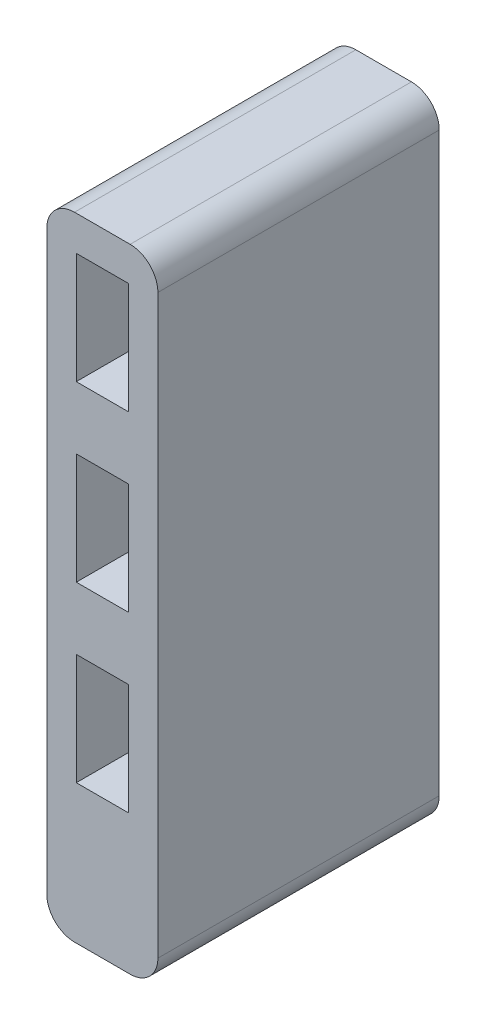
ISO-10303-21;
HEADER;
FILE_DESCRIPTION(('STEP AP214'),'2;1');
FILE_NAME('part.step','',(''),(''),'','','');
FILE_SCHEMA(('AUTOMOTIVE_DESIGN { 1 0 10303 214 1 1 1 1 }'));
ENDSEC;
DATA;
#1=APPLICATION_CONTEXT('core data for automotive mechanical design processes');
#2=APPLICATION_PROTOCOL_DEFINITION('international standard','automotive_design',2000,#1);
#3=PRODUCT_CONTEXT('',#1,'mechanical');
#4=PRODUCT('Part','Part','',(#3));
#5=PRODUCT_RELATED_PRODUCT_CATEGORY('part','',(#4));
#6=PRODUCT_DEFINITION_FORMATION('','',#4);
#7=PRODUCT_DEFINITION_CONTEXT('part definition',#1,'design');
#8=PRODUCT_DEFINITION('design','',#6,#7);
#9=PRODUCT_DEFINITION_SHAPE('','',#8);
#10=(LENGTH_UNIT() NAMED_UNIT(*) SI_UNIT(.MILLI.,.METRE.));
#11=(NAMED_UNIT(*) PLANE_ANGLE_UNIT() SI_UNIT($,.RADIAN.));
#12=(NAMED_UNIT(*) SI_UNIT($,.STERADIAN.) SOLID_ANGLE_UNIT());
#13=UNCERTAINTY_MEASURE_WITH_UNIT(LENGTH_MEASURE(1.E-05),#10,'distance_accuracy_value','');
#14=(GEOMETRIC_REPRESENTATION_CONTEXT(3) GLOBAL_UNCERTAINTY_ASSIGNED_CONTEXT((#13)) GLOBAL_UNIT_ASSIGNED_CONTEXT((#10,
#11,#12)) REPRESENTATION_CONTEXT('',''));
#15=CARTESIAN_POINT('',(0.,0.,0.));
#16=DIRECTION('',(0.,0.,1.));
#17=DIRECTION('',(1.,0.,0.));
#18=AXIS2_PLACEMENT_3D('',#15,#16,#17);
#19=CARTESIAN_POINT('',(-4.,-41.5,40.5));
#20=DIRECTION('',(0.,0.,-1.));
#21=DIRECTION('',(-1.,0.,0.));
#22=AXIS2_PLACEMENT_3D('',#19,#20,#21);
#23=CYLINDRICAL_SURFACE('',#22,4.);
#24=CARTESIAN_POINT('',(-4.,-41.5,0.));
#25=DIRECTION('',(0.,0.,1.));
#26=DIRECTION('',(-1.,0.,0.));
#27=AXIS2_PLACEMENT_3D('',#24,#25,#26);
#28=CIRCLE('',#27,4.);
#29=CARTESIAN_POINT('',(-8.,-41.5,0.));
#30=VERTEX_POINT('',#29);
#31=CARTESIAN_POINT('',(-3.99999999999997,-45.5,0.));
#32=VERTEX_POINT('',#31);
#33=EDGE_CURVE('E263',#30,#32,#28,.T.);
#34=ORIENTED_EDGE('',*,*,#33,.T.);
#35=DIRECTION('',(0.,0.,-1.));
#36=VECTOR('',#35,1.);
#37=CARTESIAN_POINT('',(-3.99999999999997,-45.5,40.5));
#38=LINE('',#37,#36);
#39=CARTESIAN_POINT('',(-3.99999999999997,-45.5,40.5));
#40=VERTEX_POINT('',#39);
#41=EDGE_CURVE('E11',#40,#32,#38,.T.);
#42=ORIENTED_EDGE('',*,*,#41,.F.);
#43=CARTESIAN_POINT('',(-4.,-41.5,40.5));
#44=DIRECTION('',(0.,0.,1.));
#45=DIRECTION('',(-1.,0.,0.));
#46=AXIS2_PLACEMENT_3D('',#43,#44,#45);
#47=CIRCLE('',#46,4.);
#48=CARTESIAN_POINT('',(-8.,-41.5,40.5));
#49=VERTEX_POINT('',#48);
#50=EDGE_CURVE('E270',#49,#40,#47,.T.);
#51=ORIENTED_EDGE('',*,*,#50,.F.);
#52=DIRECTION('',(0.,0.,-1.));
#53=VECTOR('',#52,1.);
#54=CARTESIAN_POINT('',(-8.,-41.5,40.5));
#55=LINE('',#54,#53);
#56=EDGE_CURVE('E288',#49,#30,#55,.T.);
#57=ORIENTED_EDGE('',*,*,#56,.T.);
#58=EDGE_LOOP('',(#34,#42,#51,#57));
#59=FACE_BOUND('',#58,.T.);
#60=ADVANCED_FACE('F33',(#59),#23,.T.);
#61=CARTESIAN_POINT('',(-3.99999999999997,-45.5,40.5));
#62=DIRECTION('',(0.,1.,0.));
#63=DIRECTION('',(0.,0.,1.));
#64=AXIS2_PLACEMENT_3D('',#61,#62,#63);
#65=PLANE('',#64);
#66=DIRECTION('',(1.,0.,0.));
#67=VECTOR('',#66,1.);
#68=CARTESIAN_POINT('',(-3.99999999999997,-45.5,0.));
#69=LINE('',#68,#67);
#70=CARTESIAN_POINT('',(3.99999999999997,-45.5,0.));
#71=VERTEX_POINT('',#70);
#72=EDGE_CURVE('E291',#32,#71,#69,.T.);
#73=ORIENTED_EDGE('',*,*,#72,.T.);
#74=DIRECTION('',(0.,0.,-1.));
#75=VECTOR('',#74,1.);
#76=CARTESIAN_POINT('',(3.99999999999997,-45.5,40.5));
#77=LINE('',#76,#75);
#78=CARTESIAN_POINT('',(3.99999999999997,-45.5,40.5));
#79=VERTEX_POINT('',#78);
#80=EDGE_CURVE('E40',#79,#71,#77,.T.);
#81=ORIENTED_EDGE('',*,*,#80,.F.);
#82=DIRECTION('',(1.,0.,0.));
#83=VECTOR('',#82,1.);
#84=CARTESIAN_POINT('',(-3.99999999999997,-45.5,40.5));
#85=LINE('',#84,#83);
#86=EDGE_CURVE('E273',#40,#79,#85,.T.);
#87=ORIENTED_EDGE('',*,*,#86,.F.);
#88=ORIENTED_EDGE('',*,*,#41,.T.);
#89=EDGE_LOOP('',(#73,#81,#87,#88));
#90=FACE_BOUND('',#89,.T.);
#91=ADVANCED_FACE('F348',(#90),#65,.F.);
#92=CARTESIAN_POINT('',(4.,-41.5,40.5));
#93=DIRECTION('',(0.,0.,-1.));
#94=DIRECTION('',(-1.,0.,0.));
#95=AXIS2_PLACEMENT_3D('',#92,#93,#94);
#96=CYLINDRICAL_SURFACE('',#95,4.);
#97=CARTESIAN_POINT('',(4.,-41.5,0.));
#98=DIRECTION('',(0.,0.,1.));
#99=DIRECTION('',(1.,0.,0.));
#100=AXIS2_PLACEMENT_3D('',#97,#98,#99);
#101=CIRCLE('',#100,4.);
#102=CARTESIAN_POINT('',(8.,-41.5,0.));
#103=VERTEX_POINT('',#102);
#104=EDGE_CURVE('E293',#71,#103,#101,.T.);
#105=ORIENTED_EDGE('',*,*,#104,.T.);
#106=DIRECTION('',(0.,0.,-1.));
#107=VECTOR('',#106,1.);
#108=CARTESIAN_POINT('',(8.,-41.5,40.5));
#109=LINE('',#108,#107);
#110=CARTESIAN_POINT('',(8.,-41.5,40.5));
#111=VERTEX_POINT('',#110);
#112=EDGE_CURVE('E318',#111,#103,#109,.T.);
#113=ORIENTED_EDGE('',*,*,#112,.F.);
#114=CARTESIAN_POINT('',(4.,-41.5,40.5));
#115=DIRECTION('',(0.,0.,1.));
#116=DIRECTION('',(1.,0.,0.));
#117=AXIS2_PLACEMENT_3D('',#114,#115,#116);
#118=CIRCLE('',#117,4.);
#119=EDGE_CURVE('E276',#79,#111,#118,.T.);
#120=ORIENTED_EDGE('',*,*,#119,.F.);
#121=ORIENTED_EDGE('',*,*,#80,.T.);
#122=EDGE_LOOP('',(#105,#113,#120,#121));
#123=FACE_BOUND('',#122,.T.);
#124=ADVANCED_FACE('F325',(#123),#96,.T.);
#125=CARTESIAN_POINT('',(8.,-41.5,40.5));
#126=DIRECTION('',(-1.,0.,0.));
#127=DIRECTION('',(0.,0.,1.));
#128=AXIS2_PLACEMENT_3D('',#125,#126,#127);
#129=PLANE('',#128);
#130=DIRECTION('',(0.,1.,0.));
#131=VECTOR('',#130,1.);
#132=CARTESIAN_POINT('',(8.,-41.5,0.));
#133=LINE('',#132,#131);
#134=CARTESIAN_POINT('',(8.,41.5,0.));
#135=VERTEX_POINT('',#134);
#136=EDGE_CURVE('E295',#103,#135,#133,.T.);
#137=ORIENTED_EDGE('',*,*,#136,.T.);
#138=DIRECTION('',(0.,0.,-1.));
#139=VECTOR('',#138,1.);
#140=CARTESIAN_POINT('',(8.,41.5,40.5));
#141=LINE('',#140,#139);
#142=CARTESIAN_POINT('',(8.,41.5,40.5));
#143=VERTEX_POINT('',#142);
#144=EDGE_CURVE('E315',#143,#135,#141,.T.);
#145=ORIENTED_EDGE('',*,*,#144,.F.);
#146=DIRECTION('',(0.,1.,0.));
#147=VECTOR('',#146,1.);
#148=CARTESIAN_POINT('',(8.,-41.5,40.5));
#149=LINE('',#148,#147);
#150=EDGE_CURVE('E278',#111,#143,#149,.T.);
#151=ORIENTED_EDGE('',*,*,#150,.F.);
#152=ORIENTED_EDGE('',*,*,#112,.T.);
#153=EDGE_LOOP('',(#137,#145,#151,#152));
#154=FACE_BOUND('',#153,.T.);
#155=ADVANCED_FACE('F336',(#154),#129,.F.);
#156=CARTESIAN_POINT('',(4.,41.5,40.5));
#157=DIRECTION('',(0.,0.,-1.));
#158=DIRECTION('',(-1.,0.,0.));
#159=AXIS2_PLACEMENT_3D('',#156,#157,#158);
#160=CYLINDRICAL_SURFACE('',#159,4.);
#161=CARTESIAN_POINT('',(4.,41.5,0.));
#162=DIRECTION('',(0.,0.,1.));
#163=DIRECTION('',(1.,0.,0.));
#164=AXIS2_PLACEMENT_3D('',#161,#162,#163);
#165=CIRCLE('',#164,4.);
#166=CARTESIAN_POINT('',(3.99999999999997,45.5,0.));
#167=VERTEX_POINT('',#166);
#168=EDGE_CURVE('E297',#135,#167,#165,.T.);
#169=ORIENTED_EDGE('',*,*,#168,.T.);
#170=DIRECTION('',(0.,0.,-1.));
#171=VECTOR('',#170,1.);
#172=CARTESIAN_POINT('',(3.99999999999997,45.5,40.5));
#173=LINE('',#172,#171);
#174=CARTESIAN_POINT('',(3.99999999999997,45.5,40.5));
#175=VERTEX_POINT('',#174);
#176=EDGE_CURVE('E312',#175,#167,#173,.T.);
#177=ORIENTED_EDGE('',*,*,#176,.F.);
#178=CARTESIAN_POINT('',(4.,41.5,40.5));
#179=DIRECTION('',(0.,0.,1.));
#180=DIRECTION('',(1.,0.,0.));
#181=AXIS2_PLACEMENT_3D('',#178,#179,#180);
#182=CIRCLE('',#181,4.);
#183=EDGE_CURVE('E280',#143,#175,#182,.T.);
#184=ORIENTED_EDGE('',*,*,#183,.F.);
#185=ORIENTED_EDGE('',*,*,#144,.T.);
#186=EDGE_LOOP('',(#169,#177,#184,#185));
#187=FACE_BOUND('',#186,.T.);
#188=ADVANCED_FACE('F340',(#187),#160,.T.);
#189=CARTESIAN_POINT('',(-3.99999999999997,45.5,40.5));
#190=DIRECTION('',(0.,-1.,0.));
#191=DIRECTION('',(0.,0.,-1.));
#192=AXIS2_PLACEMENT_3D('',#189,#190,#191);
#193=PLANE('',#192);
#194=DIRECTION('',(-1.,0.,0.));
#195=VECTOR('',#194,1.);
#196=CARTESIAN_POINT('',(-3.99999999999997,45.5,0.));
#197=LINE('',#196,#195);
#198=CARTESIAN_POINT('',(-3.99999999999997,45.5,0.));
#199=VERTEX_POINT('',#198);
#200=EDGE_CURVE('E299',#167,#199,#197,.T.);
#201=ORIENTED_EDGE('',*,*,#200,.T.);
#202=DIRECTION('',(0.,0.,-1.));
#203=VECTOR('',#202,1.);
#204=CARTESIAN_POINT('',(-3.99999999999997,45.5,40.5));
#205=LINE('',#204,#203);
#206=CARTESIAN_POINT('',(-3.99999999999997,45.5,40.5));
#207=VERTEX_POINT('',#206);
#208=EDGE_CURVE('E309',#207,#199,#205,.T.);
#209=ORIENTED_EDGE('',*,*,#208,.F.);
#210=DIRECTION('',(-1.,0.,0.));
#211=VECTOR('',#210,1.);
#212=CARTESIAN_POINT('',(-3.99999999999997,45.5,40.5));
#213=LINE('',#212,#211);
#214=EDGE_CURVE('E282',#175,#207,#213,.T.);
#215=ORIENTED_EDGE('',*,*,#214,.F.);
#216=ORIENTED_EDGE('',*,*,#176,.T.);
#217=EDGE_LOOP('',(#201,#209,#215,#216));
#218=FACE_BOUND('',#217,.T.);
#219=ADVANCED_FACE('F361',(#218),#193,.F.);
#220=CARTESIAN_POINT('',(-4.,41.5,40.5));
#221=DIRECTION('',(0.,0.,-1.));
#222=DIRECTION('',(-1.,0.,0.));
#223=AXIS2_PLACEMENT_3D('',#220,#221,#222);
#224=CYLINDRICAL_SURFACE('',#223,4.);
#225=CARTESIAN_POINT('',(-4.,41.5,0.));
#226=DIRECTION('',(0.,0.,1.));
#227=DIRECTION('',(-1.,0.,0.));
#228=AXIS2_PLACEMENT_3D('',#225,#226,#227);
#229=CIRCLE('',#228,4.);
#230=CARTESIAN_POINT('',(-8.,41.5,0.));
#231=VERTEX_POINT('',#230);
#232=EDGE_CURVE('E301',#199,#231,#229,.T.);
#233=ORIENTED_EDGE('',*,*,#232,.T.);
#234=DIRECTION('',(0.,0.,-1.));
#235=VECTOR('',#234,1.);
#236=CARTESIAN_POINT('',(-8.,41.5,40.5));
#237=LINE('',#236,#235);
#238=CARTESIAN_POINT('',(-8.,41.5,40.5));
#239=VERTEX_POINT('',#238);
#240=EDGE_CURVE('E306',#239,#231,#237,.T.);
#241=ORIENTED_EDGE('',*,*,#240,.F.);
#242=CARTESIAN_POINT('',(-4.,41.5,40.5));
#243=DIRECTION('',(0.,0.,1.));
#244=DIRECTION('',(-1.,0.,0.));
#245=AXIS2_PLACEMENT_3D('',#242,#243,#244);
#246=CIRCLE('',#245,4.);
#247=EDGE_CURVE('E284',#207,#239,#246,.T.);
#248=ORIENTED_EDGE('',*,*,#247,.F.);
#249=ORIENTED_EDGE('',*,*,#208,.T.);
#250=EDGE_LOOP('',(#233,#241,#248,#249));
#251=FACE_BOUND('',#250,.T.);
#252=ADVANCED_FACE('F359',(#251),#224,.T.);
#253=CARTESIAN_POINT('',(-8.,-41.5,40.5));
#254=DIRECTION('',(1.,0.,0.));
#255=DIRECTION('',(0.,0.,-1.));
#256=AXIS2_PLACEMENT_3D('',#253,#254,#255);
#257=PLANE('',#256);
#258=DIRECTION('',(0.,-1.,0.));
#259=VECTOR('',#258,1.);
#260=CARTESIAN_POINT('',(-8.,-41.5,0.));
#261=LINE('',#260,#259);
#262=EDGE_CURVE('E274',#231,#30,#261,.T.);
#263=ORIENTED_EDGE('',*,*,#262,.T.);
#264=ORIENTED_EDGE('',*,*,#56,.F.);
#265=DIRECTION('',(0.,-1.,0.));
#266=VECTOR('',#265,1.);
#267=CARTESIAN_POINT('',(-8.,-41.5,40.5));
#268=LINE('',#267,#266);
#269=EDGE_CURVE('E286',#239,#49,#268,.T.);
#270=ORIENTED_EDGE('',*,*,#269,.F.);
#271=ORIENTED_EDGE('',*,*,#240,.T.);
#272=EDGE_LOOP('',(#263,#264,#270,#271));
#273=FACE_BOUND('',#272,.T.);
#274=ADVANCED_FACE('F354',(#273),#257,.F.);
#275=CARTESIAN_POINT('',(-4.,-41.5,40.5));
#276=DIRECTION('',(0.,0.,-1.));
#277=DIRECTION('',(-1.,0.,0.));
#278=AXIS2_PLACEMENT_3D('',#275,#276,#277);
#279=PLANE('',#278);
#280=DIRECTION('',(-1.,0.,0.));
#281=VECTOR('',#280,1.);
#282=CARTESIAN_POINT('',(-3.74999999999947,-9.5,40.5));
#283=LINE('',#282,#281);
#284=CARTESIAN_POINT('',(3.75000000000053,-9.5,40.5));
#285=VERTEX_POINT('',#284);
#286=CARTESIAN_POINT('',(-3.74999999999947,-9.5,40.5));
#287=VERTEX_POINT('',#286);
#288=EDGE_CURVE('E198',#285,#287,#283,.T.);
#289=ORIENTED_EDGE('',*,*,#288,.F.);
#290=DIRECTION('',(0.,1.,0.));
#291=VECTOR('',#290,1.);
#292=CARTESIAN_POINT('',(3.75000000000053,-9.5,40.5));
#293=LINE('',#292,#291);
#294=CARTESIAN_POINT('',(3.75000000000053,-25.5,40.5));
#295=VERTEX_POINT('',#294);
#296=EDGE_CURVE('E47',#295,#285,#293,.T.);
#297=ORIENTED_EDGE('',*,*,#296,.F.);
#298=DIRECTION('',(1.,0.,0.));
#299=VECTOR('',#298,1.);
#300=CARTESIAN_POINT('',(-3.74999999999947,-25.5,40.5));
#301=LINE('',#300,#299);
#302=CARTESIAN_POINT('',(-3.74999999999947,-25.5,40.5));
#303=VERTEX_POINT('',#302);
#304=EDGE_CURVE('E189',#303,#295,#301,.T.);
#305=ORIENTED_EDGE('',*,*,#304,.F.);
#306=DIRECTION('',(0.,-1.,0.));
#307=VECTOR('',#306,1.);
#308=CARTESIAN_POINT('',(-3.74999999999947,-9.5,40.5));
#309=LINE('',#308,#307);
#310=EDGE_CURVE('E192',#287,#303,#309,.T.);
#311=ORIENTED_EDGE('',*,*,#310,.F.);
#312=EDGE_LOOP('',(#289,#297,#305,#311));
#313=FACE_BOUND('',#312,.T.);
#314=DIRECTION('',(-1.,0.,0.));
#315=VECTOR('',#314,1.);
#316=CARTESIAN_POINT('',(-3.74999999999974,15.5,40.5));
#317=LINE('',#316,#315);
#318=CARTESIAN_POINT('',(3.75000000000027,15.5,40.5));
#319=VERTEX_POINT('',#318);
#320=CARTESIAN_POINT('',(-3.74999999999974,15.5,40.5));
#321=VERTEX_POINT('',#320);
#322=EDGE_CURVE('E222',#319,#321,#317,.T.);
#323=ORIENTED_EDGE('',*,*,#322,.F.);
#324=DIRECTION('',(0.,1.,0.));
#325=VECTOR('',#324,1.);
#326=CARTESIAN_POINT('',(3.75000000000026,15.5,40.5));
#327=LINE('',#326,#325);
#328=CARTESIAN_POINT('',(3.75000000000027,-0.5,40.5));
#329=VERTEX_POINT('',#328);
#330=EDGE_CURVE('E55',#329,#319,#327,.T.);
#331=ORIENTED_EDGE('',*,*,#330,.F.);
#332=DIRECTION('',(1.,0.,0.));
#333=VECTOR('',#332,1.);
#334=CARTESIAN_POINT('',(-3.74999999999973,-0.5,40.5));
#335=LINE('',#334,#333);
#336=CARTESIAN_POINT('',(-3.74999999999973,-0.5,40.5));
#337=VERTEX_POINT('',#336);
#338=EDGE_CURVE('E211',#337,#329,#335,.T.);
#339=ORIENTED_EDGE('',*,*,#338,.F.);
#340=DIRECTION('',(0.,-1.,0.));
#341=VECTOR('',#340,1.);
#342=CARTESIAN_POINT('',(-3.74999999999974,15.5,40.5));
#343=LINE('',#342,#341);
#344=EDGE_CURVE('E225',#321,#337,#343,.T.);
#345=ORIENTED_EDGE('',*,*,#344,.F.);
#346=EDGE_LOOP('',(#323,#331,#339,#345));
#347=FACE_BOUND('',#346,.T.);
#348=DIRECTION('',(-1.,0.,0.));
#349=VECTOR('',#348,1.);
#350=CARTESIAN_POINT('',(-3.75,40.5,40.5));
#351=LINE('',#350,#349);
#352=CARTESIAN_POINT('',(3.75,40.5,40.5));
#353=VERTEX_POINT('',#352);
#354=CARTESIAN_POINT('',(-3.75,40.5,40.5));
#355=VERTEX_POINT('',#354);
#356=EDGE_CURVE('E253',#353,#355,#351,.T.);
#357=ORIENTED_EDGE('',*,*,#356,.F.);
#358=DIRECTION('',(0.,1.,0.));
#359=VECTOR('',#358,1.);
#360=CARTESIAN_POINT('',(3.75,40.5,40.5));
#361=LINE('',#360,#359);
#362=CARTESIAN_POINT('',(3.75,24.5,40.5));
#363=VERTEX_POINT('',#362);
#364=EDGE_CURVE('E232',#363,#353,#361,.T.);
#365=ORIENTED_EDGE('',*,*,#364,.F.);
#366=DIRECTION('',(1.,0.,0.));
#367=VECTOR('',#366,1.);
#368=CARTESIAN_POINT('',(-3.75,24.5,40.5));
#369=LINE('',#368,#367);
#370=CARTESIAN_POINT('',(-3.75,24.5,40.5));
#371=VERTEX_POINT('',#370);
#372=EDGE_CURVE('E242',#371,#363,#369,.T.);
#373=ORIENTED_EDGE('',*,*,#372,.F.);
#374=DIRECTION('',(0.,-1.,0.));
#375=VECTOR('',#374,1.);
#376=CARTESIAN_POINT('',(-3.75,40.5,40.5));
#377=LINE('',#376,#375);
#378=EDGE_CURVE('E256',#355,#371,#377,.T.);
#379=ORIENTED_EDGE('',*,*,#378,.F.);
#380=EDGE_LOOP('',(#357,#365,#373,#379));
#381=FACE_BOUND('',#380,.T.);
#382=ORIENTED_EDGE('',*,*,#50,.T.);
#383=ORIENTED_EDGE('',*,*,#86,.T.);
#384=ORIENTED_EDGE('',*,*,#119,.T.);
#385=ORIENTED_EDGE('',*,*,#150,.T.);
#386=ORIENTED_EDGE('',*,*,#183,.T.);
#387=ORIENTED_EDGE('',*,*,#214,.T.);
#388=ORIENTED_EDGE('',*,*,#247,.T.);
#389=ORIENTED_EDGE('',*,*,#269,.T.);
#390=EDGE_LOOP('',(#382,#383,#384,#385,#386,#387,#388,#389));
#391=FACE_BOUND('',#390,.T.);
#392=ADVANCED_FACE('F344',(#313,#347,#381,#391),#279,.F.);
#393=CARTESIAN_POINT('',(-4.,-41.5,0.));
#394=DIRECTION('',(0.,0.,-1.));
#395=DIRECTION('',(-1.,0.,0.));
#396=AXIS2_PLACEMENT_3D('',#393,#394,#395);
#397=PLANE('',#396);
#398=ORIENTED_EDGE('',*,*,#33,.F.);
#399=ORIENTED_EDGE('',*,*,#262,.F.);
#400=ORIENTED_EDGE('',*,*,#232,.F.);
#401=ORIENTED_EDGE('',*,*,#200,.F.);
#402=ORIENTED_EDGE('',*,*,#168,.F.);
#403=ORIENTED_EDGE('',*,*,#136,.F.);
#404=ORIENTED_EDGE('',*,*,#104,.F.);
#405=ORIENTED_EDGE('',*,*,#72,.F.);
#406=EDGE_LOOP('',(#398,#399,#400,#401,#402,#403,#404,#405));
#407=FACE_BOUND('',#406,.T.);
#408=ADVANCED_FACE('F331',(#407),#397,.T.);
#409=CARTESIAN_POINT('',(3.75,40.5,28.));
#410=DIRECTION('',(1.,0.,0.));
#411=DIRECTION('',(0.,1.,0.));
#412=AXIS2_PLACEMENT_3D('',#409,#410,#411);
#413=PLANE('',#412);
#414=ORIENTED_EDGE('',*,*,#364,.T.);
#415=DIRECTION('',(0.,0.,1.));
#416=VECTOR('',#415,1.);
#417=CARTESIAN_POINT('',(3.75,40.5,28.));
#418=LINE('',#417,#416);
#419=CARTESIAN_POINT('',(3.75,40.5,28.));
#420=VERTEX_POINT('',#419);
#421=EDGE_CURVE('E251',#420,#353,#418,.T.);
#422=ORIENTED_EDGE('',*,*,#421,.F.);
#423=DIRECTION('',(0.,1.,0.));
#424=VECTOR('',#423,1.);
#425=CARTESIAN_POINT('',(3.75,40.5,28.));
#426=LINE('',#425,#424);
#427=CARTESIAN_POINT('',(3.75,24.5,28.));
#428=VERTEX_POINT('',#427);
#429=EDGE_CURVE('E238',#428,#420,#426,.T.);
#430=ORIENTED_EDGE('',*,*,#429,.F.);
#431=DIRECTION('',(0.,0.,1.));
#432=VECTOR('',#431,1.);
#433=CARTESIAN_POINT('',(3.75,24.5,28.));
#434=LINE('',#433,#432);
#435=EDGE_CURVE('E261',#428,#363,#434,.T.);
#436=ORIENTED_EDGE('',*,*,#435,.T.);
#437=EDGE_LOOP('',(#414,#422,#430,#436));
#438=FACE_BOUND('',#437,.T.);
#439=ADVANCED_FACE('F417',(#438),#413,.F.);
#440=CARTESIAN_POINT('',(-3.75,24.5,28.));
#441=DIRECTION('',(0.,-1.,0.));
#442=DIRECTION('',(0.,0.,-1.));
#443=AXIS2_PLACEMENT_3D('',#440,#441,#442);
#444=PLANE('',#443);
#445=ORIENTED_EDGE('',*,*,#372,.T.);
#446=ORIENTED_EDGE('',*,*,#435,.F.);
#447=DIRECTION('',(1.,0.,0.));
#448=VECTOR('',#447,1.);
#449=CARTESIAN_POINT('',(-3.75,24.5,28.));
#450=LINE('',#449,#448);
#451=CARTESIAN_POINT('',(-3.75,24.5,28.));
#452=VERTEX_POINT('',#451);
#453=EDGE_CURVE('E248',#452,#428,#450,.T.);
#454=ORIENTED_EDGE('',*,*,#453,.F.);
#455=DIRECTION('',(0.,0.,1.));
#456=VECTOR('',#455,1.);
#457=CARTESIAN_POINT('',(-3.75,24.5,28.));
#458=LINE('',#457,#456);
#459=EDGE_CURVE('E264',#452,#371,#458,.T.);
#460=ORIENTED_EDGE('',*,*,#459,.T.);
#461=EDGE_LOOP('',(#445,#446,#454,#460));
#462=FACE_BOUND('',#461,.T.);
#463=ADVANCED_FACE('F431',(#462),#444,.F.);
#464=CARTESIAN_POINT('',(-3.75,40.5,28.));
#465=DIRECTION('',(-1.,0.,0.));
#466=DIRECTION('',(0.,-1.,0.));
#467=AXIS2_PLACEMENT_3D('',#464,#465,#466);
#468=PLANE('',#467);
#469=ORIENTED_EDGE('',*,*,#378,.T.);
#470=ORIENTED_EDGE('',*,*,#459,.F.);
#471=DIRECTION('',(0.,-1.,0.));
#472=VECTOR('',#471,1.);
#473=CARTESIAN_POINT('',(-3.75,40.5,28.));
#474=LINE('',#473,#472);
#475=CARTESIAN_POINT('',(-3.75,40.5,28.));
#476=VERTEX_POINT('',#475);
#477=EDGE_CURVE('E245',#476,#452,#474,.T.);
#478=ORIENTED_EDGE('',*,*,#477,.F.);
#479=DIRECTION('',(0.,0.,1.));
#480=VECTOR('',#479,1.);
#481=CARTESIAN_POINT('',(-3.75,40.5,28.));
#482=LINE('',#481,#480);
#483=EDGE_CURVE('E266',#476,#355,#482,.T.);
#484=ORIENTED_EDGE('',*,*,#483,.T.);
#485=EDGE_LOOP('',(#469,#470,#478,#484));
#486=FACE_BOUND('',#485,.T.);
#487=ADVANCED_FACE('F441',(#486),#468,.F.);
#488=CARTESIAN_POINT('',(-3.75,40.5,28.));
#489=DIRECTION('',(0.,1.,0.));
#490=DIRECTION('',(0.,0.,1.));
#491=AXIS2_PLACEMENT_3D('',#488,#489,#490);
#492=PLANE('',#491);
#493=ORIENTED_EDGE('',*,*,#356,.T.);
#494=ORIENTED_EDGE('',*,*,#483,.F.);
#495=DIRECTION('',(-1.,0.,0.));
#496=VECTOR('',#495,1.);
#497=CARTESIAN_POINT('',(-3.75,40.5,28.));
#498=LINE('',#497,#496);
#499=EDGE_CURVE('E241',#420,#476,#498,.T.);
#500=ORIENTED_EDGE('',*,*,#499,.F.);
#501=ORIENTED_EDGE('',*,*,#421,.T.);
#502=EDGE_LOOP('',(#493,#494,#500,#501));
#503=FACE_BOUND('',#502,.T.);
#504=ADVANCED_FACE('F451',(#503),#492,.F.);
#505=CARTESIAN_POINT('',(0.,0.,28.));
#506=DIRECTION('',(0.,0.,1.));
#507=DIRECTION('',(1.,0.,0.));
#508=AXIS2_PLACEMENT_3D('',#505,#506,#507);
#509=PLANE('',#508);
#510=ORIENTED_EDGE('',*,*,#429,.T.);
#511=ORIENTED_EDGE('',*,*,#499,.T.);
#512=ORIENTED_EDGE('',*,*,#477,.T.);
#513=ORIENTED_EDGE('',*,*,#453,.T.);
#514=EDGE_LOOP('',(#510,#511,#512,#513));
#515=FACE_BOUND('',#514,.T.);
#516=ADVANCED_FACE('F461',(#515),#509,.T.);
#517=CARTESIAN_POINT('',(3.75000000000026,15.5,28.));
#518=DIRECTION('',(1.,0.,0.));
#519=DIRECTION('',(0.,1.,0.));
#520=AXIS2_PLACEMENT_3D('',#517,#518,#519);
#521=PLANE('',#520);
#522=ORIENTED_EDGE('',*,*,#330,.T.);
#523=DIRECTION('',(0.,0.,1.));
#524=VECTOR('',#523,1.);
#525=CARTESIAN_POINT('',(3.75000000000026,15.5,28.));
#526=LINE('',#525,#524);
#527=CARTESIAN_POINT('',(3.75000000000026,15.5,28.));
#528=VERTEX_POINT('',#527);
#529=EDGE_CURVE('E220',#528,#319,#526,.T.);
#530=ORIENTED_EDGE('',*,*,#529,.F.);
#531=DIRECTION('',(0.,1.,0.));
#532=VECTOR('',#531,1.);
#533=CARTESIAN_POINT('',(3.75000000000026,15.5,28.));
#534=LINE('',#533,#532);
#535=CARTESIAN_POINT('',(3.75000000000027,-0.5,28.));
#536=VERTEX_POINT('',#535);
#537=EDGE_CURVE('E207',#536,#528,#534,.T.);
#538=ORIENTED_EDGE('',*,*,#537,.F.);
#539=DIRECTION('',(0.,0.,1.));
#540=VECTOR('',#539,1.);
#541=CARTESIAN_POINT('',(3.75000000000027,-0.5,28.));
#542=LINE('',#541,#540);
#543=EDGE_CURVE('E230',#536,#329,#542,.T.);
#544=ORIENTED_EDGE('',*,*,#543,.T.);
#545=EDGE_LOOP('',(#522,#530,#538,#544));
#546=FACE_BOUND('',#545,.T.);
#547=ADVANCED_FACE('F471',(#546),#521,.F.);
#548=CARTESIAN_POINT('',(-3.74999999999973,-0.5,28.));
#549=DIRECTION('',(0.,-1.,0.));
#550=DIRECTION('',(0.,0.,-1.));
#551=AXIS2_PLACEMENT_3D('',#548,#549,#550);
#552=PLANE('',#551);
#553=ORIENTED_EDGE('',*,*,#338,.T.);
#554=ORIENTED_EDGE('',*,*,#543,.F.);
#555=DIRECTION('',(1.,0.,0.));
#556=VECTOR('',#555,1.);
#557=CARTESIAN_POINT('',(-3.74999999999973,-0.5,28.));
#558=LINE('',#557,#556);
#559=CARTESIAN_POINT('',(-3.74999999999973,-0.5,28.));
#560=VERTEX_POINT('',#559);
#561=EDGE_CURVE('E217',#560,#536,#558,.T.);
#562=ORIENTED_EDGE('',*,*,#561,.F.);
#563=DIRECTION('',(0.,0.,1.));
#564=VECTOR('',#563,1.);
#565=CARTESIAN_POINT('',(-3.74999999999973,-0.5,28.));
#566=LINE('',#565,#564);
#567=EDGE_CURVE('E233',#560,#337,#566,.T.);
#568=ORIENTED_EDGE('',*,*,#567,.T.);
#569=EDGE_LOOP('',(#553,#554,#562,#568));
#570=FACE_BOUND('',#569,.T.);
#571=ADVANCED_FACE('F481',(#570),#552,.F.);
#572=CARTESIAN_POINT('',(-3.74999999999974,15.5,28.));
#573=DIRECTION('',(-1.,0.,0.));
#574=DIRECTION('',(0.,-1.,0.));
#575=AXIS2_PLACEMENT_3D('',#572,#573,#574);
#576=PLANE('',#575);
#577=ORIENTED_EDGE('',*,*,#344,.T.);
#578=ORIENTED_EDGE('',*,*,#567,.F.);
#579=DIRECTION('',(0.,-1.,0.));
#580=VECTOR('',#579,1.);
#581=CARTESIAN_POINT('',(-3.74999999999974,15.5,28.));
#582=LINE('',#581,#580);
#583=CARTESIAN_POINT('',(-3.74999999999974,15.5,28.));
#584=VERTEX_POINT('',#583);
#585=EDGE_CURVE('E214',#584,#560,#582,.T.);
#586=ORIENTED_EDGE('',*,*,#585,.F.);
#587=DIRECTION('',(0.,0.,1.));
#588=VECTOR('',#587,1.);
#589=CARTESIAN_POINT('',(-3.74999999999974,15.5,28.));
#590=LINE('',#589,#588);
#591=EDGE_CURVE('E235',#584,#321,#590,.T.);
#592=ORIENTED_EDGE('',*,*,#591,.T.);
#593=EDGE_LOOP('',(#577,#578,#586,#592));
#594=FACE_BOUND('',#593,.T.);
#595=ADVANCED_FACE('F490',(#594),#576,.F.);
#596=CARTESIAN_POINT('',(-3.74999999999974,15.5,28.));
#597=DIRECTION('',(0.,1.,0.));
#598=DIRECTION('',(0.,0.,1.));
#599=AXIS2_PLACEMENT_3D('',#596,#597,#598);
#600=PLANE('',#599);
#601=ORIENTED_EDGE('',*,*,#322,.T.);
#602=ORIENTED_EDGE('',*,*,#591,.F.);
#603=DIRECTION('',(-1.,0.,0.));
#604=VECTOR('',#603,1.);
#605=CARTESIAN_POINT('',(-3.74999999999974,15.5,28.));
#606=LINE('',#605,#604);
#607=EDGE_CURVE('E210',#528,#584,#606,.T.);
#608=ORIENTED_EDGE('',*,*,#607,.F.);
#609=ORIENTED_EDGE('',*,*,#529,.T.);
#610=EDGE_LOOP('',(#601,#602,#608,#609));
#611=FACE_BOUND('',#610,.T.);
#612=ADVANCED_FACE('F500',(#611),#600,.F.);
#613=CARTESIAN_POINT('',(0.,0.,28.));
#614=DIRECTION('',(0.,0.,1.));
#615=DIRECTION('',(1.,0.,0.));
#616=AXIS2_PLACEMENT_3D('',#613,#614,#615);
#617=PLANE('',#616);
#618=ORIENTED_EDGE('',*,*,#537,.T.);
#619=ORIENTED_EDGE('',*,*,#607,.T.);
#620=ORIENTED_EDGE('',*,*,#585,.T.);
#621=ORIENTED_EDGE('',*,*,#561,.T.);
#622=EDGE_LOOP('',(#618,#619,#620,#621));
#623=FACE_BOUND('',#622,.T.);
#624=ADVANCED_FACE('F510',(#623),#617,.T.);
#625=CARTESIAN_POINT('',(3.75000000000053,-9.5,28.));
#626=DIRECTION('',(1.,0.,0.));
#627=DIRECTION('',(0.,1.,0.));
#628=AXIS2_PLACEMENT_3D('',#625,#626,#627);
#629=PLANE('',#628);
#630=ORIENTED_EDGE('',*,*,#296,.T.);
#631=DIRECTION('',(0.,0.,1.));
#632=VECTOR('',#631,1.);
#633=CARTESIAN_POINT('',(3.75000000000053,-9.5,28.));
#634=LINE('',#633,#632);
#635=CARTESIAN_POINT('',(3.75000000000053,-9.5,28.));
#636=VERTEX_POINT('',#635);
#637=EDGE_CURVE('E167',#636,#285,#634,.T.);
#638=ORIENTED_EDGE('',*,*,#637,.F.);
#639=DIRECTION('',(0.,1.,0.));
#640=VECTOR('',#639,1.);
#641=CARTESIAN_POINT('',(3.75000000000053,-9.5,28.));
#642=LINE('',#641,#640);
#643=CARTESIAN_POINT('',(3.75000000000053,-25.5,28.));
#644=VERTEX_POINT('',#643);
#645=EDGE_CURVE('E171',#644,#636,#642,.T.);
#646=ORIENTED_EDGE('',*,*,#645,.F.);
#647=DIRECTION('',(0.,0.,1.));
#648=VECTOR('',#647,1.);
#649=CARTESIAN_POINT('',(3.75000000000053,-25.5,28.));
#650=LINE('',#649,#648);
#651=EDGE_CURVE('E202',#644,#295,#650,.T.);
#652=ORIENTED_EDGE('',*,*,#651,.T.);
#653=EDGE_LOOP('',(#630,#638,#646,#652));
#654=FACE_BOUND('',#653,.T.);
#655=ADVANCED_FACE('F169',(#654),#629,.F.);
#656=CARTESIAN_POINT('',(-3.74999999999947,-25.5,28.));
#657=DIRECTION('',(0.,-1.,0.));
#658=DIRECTION('',(0.,0.,-1.));
#659=AXIS2_PLACEMENT_3D('',#656,#657,#658);
#660=PLANE('',#659);
#661=ORIENTED_EDGE('',*,*,#304,.T.);
#662=ORIENTED_EDGE('',*,*,#651,.F.);
#663=DIRECTION('',(1.,0.,0.));
#664=VECTOR('',#663,1.);
#665=CARTESIAN_POINT('',(-3.74999999999947,-25.5,28.));
#666=LINE('',#665,#664);
#667=CARTESIAN_POINT('',(-3.74999999999947,-25.5,28.));
#668=VERTEX_POINT('',#667);
#669=EDGE_CURVE('E177',#668,#644,#666,.T.);
#670=ORIENTED_EDGE('',*,*,#669,.F.);
#671=DIRECTION('',(0.,0.,1.));
#672=VECTOR('',#671,1.);
#673=CARTESIAN_POINT('',(-3.74999999999947,-25.5,28.));
#674=LINE('',#673,#672);
#675=EDGE_CURVE('E204',#668,#303,#674,.T.);
#676=ORIENTED_EDGE('',*,*,#675,.T.);
#677=EDGE_LOOP('',(#661,#662,#670,#676));
#678=FACE_BOUND('',#677,.T.);
#679=ADVANCED_FACE('F529',(#678),#660,.F.);
#680=CARTESIAN_POINT('',(-3.74999999999947,-9.5,28.));
#681=DIRECTION('',(-1.,0.,0.));
#682=DIRECTION('',(0.,-1.,0.));
#683=AXIS2_PLACEMENT_3D('',#680,#681,#682);
#684=PLANE('',#683);
#685=ORIENTED_EDGE('',*,*,#310,.T.);
#686=ORIENTED_EDGE('',*,*,#675,.F.);
#687=DIRECTION('',(0.,-1.,0.));
#688=VECTOR('',#687,1.);
#689=CARTESIAN_POINT('',(-3.74999999999947,-9.5,28.));
#690=LINE('',#689,#688);
#691=CARTESIAN_POINT('',(-3.74999999999947,-9.5,28.));
#692=VERTEX_POINT('',#691);
#693=EDGE_CURVE('E185',#692,#668,#690,.T.);
#694=ORIENTED_EDGE('',*,*,#693,.F.);
#695=DIRECTION('',(0.,0.,1.));
#696=VECTOR('',#695,1.);
#697=CARTESIAN_POINT('',(-3.74999999999947,-9.5,28.));
#698=LINE('',#697,#696);
#699=EDGE_CURVE('E176',#692,#287,#698,.T.);
#700=ORIENTED_EDGE('',*,*,#699,.T.);
#701=EDGE_LOOP('',(#685,#686,#694,#700));
#702=FACE_BOUND('',#701,.T.);
#703=ADVANCED_FACE('F538',(#702),#684,.F.);
#704=CARTESIAN_POINT('',(-3.74999999999947,-9.5,28.));
#705=DIRECTION('',(0.,1.,0.));
#706=DIRECTION('',(0.,0.,1.));
#707=AXIS2_PLACEMENT_3D('',#704,#705,#706);
#708=PLANE('',#707);
#709=ORIENTED_EDGE('',*,*,#288,.T.);
#710=ORIENTED_EDGE('',*,*,#699,.F.);
#711=DIRECTION('',(-1.,0.,0.));
#712=VECTOR('',#711,1.);
#713=CARTESIAN_POINT('',(-3.74999999999947,-9.5,28.));
#714=LINE('',#713,#712);
#715=EDGE_CURVE('E180',#636,#692,#714,.T.);
#716=ORIENTED_EDGE('',*,*,#715,.F.);
#717=ORIENTED_EDGE('',*,*,#637,.T.);
#718=EDGE_LOOP('',(#709,#710,#716,#717));
#719=FACE_BOUND('',#718,.T.);
#720=ADVANCED_FACE('F181',(#719),#708,.F.);
#721=CARTESIAN_POINT('',(0.,0.,28.));
#722=DIRECTION('',(0.,0.,1.));
#723=DIRECTION('',(1.,0.,0.));
#724=AXIS2_PLACEMENT_3D('',#721,#722,#723);
#725=PLANE('',#724);
#726=ORIENTED_EDGE('',*,*,#645,.T.);
#727=ORIENTED_EDGE('',*,*,#715,.T.);
#728=ORIENTED_EDGE('',*,*,#693,.T.);
#729=ORIENTED_EDGE('',*,*,#669,.T.);
#730=EDGE_LOOP('',(#726,#727,#728,#729));
#731=FACE_BOUND('',#730,.T.);
#732=ADVANCED_FACE('F187',(#731),#725,.T.);
#733=CLOSED_SHELL('',(#60,#91,#124,#155,#188,#219,#252,#274,#392,#408,#439,#463,#487,#504,#516,
#547,#571,#595,#612,#624,#655,#679,#703,#720,#732));
#734=MANIFOLD_SOLID_BREP('B2',#733);
#735=ADVANCED_BREP_SHAPE_REPRESENTATION('',(#18,#734),#14);
#736=SHAPE_DEFINITION_REPRESENTATION(#9,#735);
ENDSEC;
END-ISO-10303-21;
